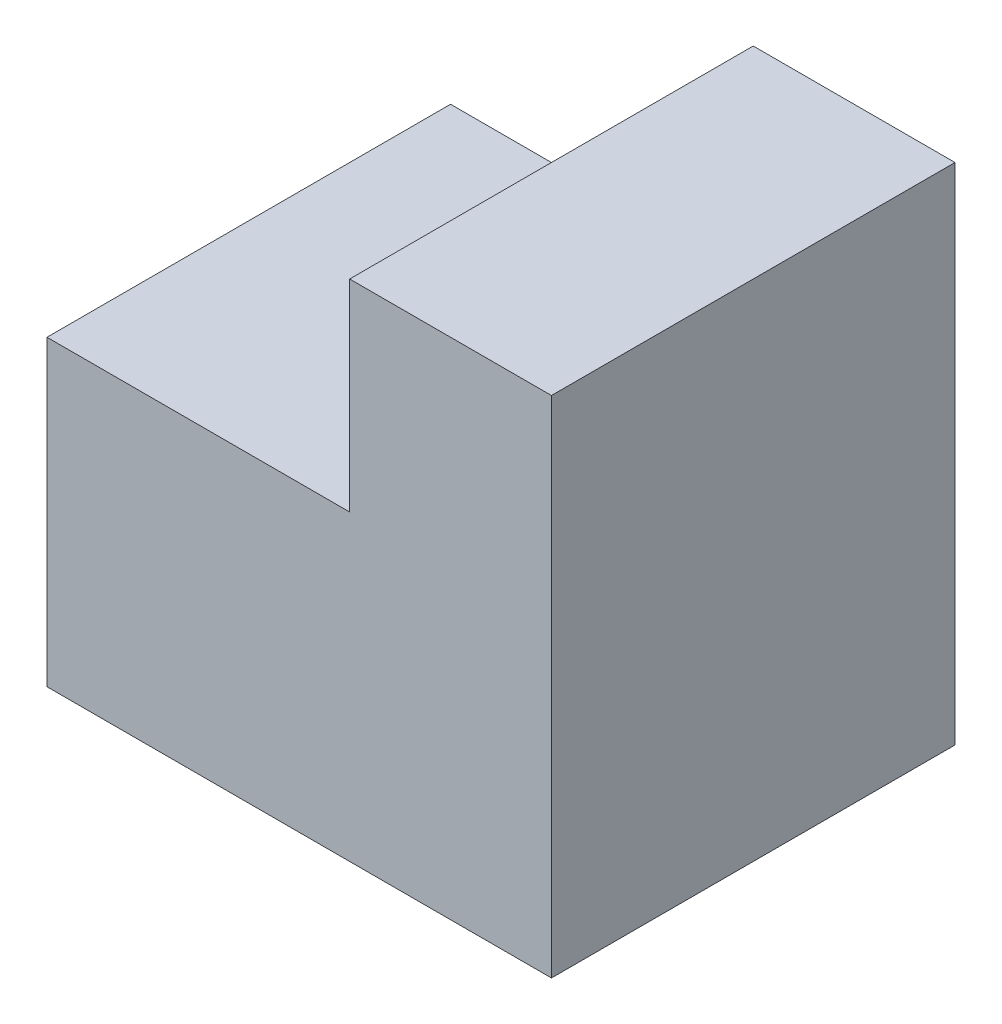
ISO-10303-21;
HEADER;
FILE_DESCRIPTION(('STEP AP214'),'2;1');
FILE_NAME('part.step','',(''),(''),'','','');
FILE_SCHEMA(('AUTOMOTIVE_DESIGN { 1 0 10303 214 1 1 1 1 }'));
ENDSEC;
DATA;
#1=APPLICATION_CONTEXT('core data for automotive mechanical design processes');
#2=APPLICATION_PROTOCOL_DEFINITION('international standard','automotive_design',2000,#1);
#3=PRODUCT_CONTEXT('',#1,'mechanical');
#4=PRODUCT('Part','Part','',(#3));
#5=PRODUCT_RELATED_PRODUCT_CATEGORY('part','',(#4));
#6=PRODUCT_DEFINITION_FORMATION('','',#4);
#7=PRODUCT_DEFINITION_CONTEXT('part definition',#1,'design');
#8=PRODUCT_DEFINITION('design','',#6,#7);
#9=PRODUCT_DEFINITION_SHAPE('','',#8);
#10=(LENGTH_UNIT() NAMED_UNIT(*) SI_UNIT(.MILLI.,.METRE.));
#11=(NAMED_UNIT(*) PLANE_ANGLE_UNIT() SI_UNIT($,.RADIAN.));
#12=(NAMED_UNIT(*) SI_UNIT($,.STERADIAN.) SOLID_ANGLE_UNIT());
#13=UNCERTAINTY_MEASURE_WITH_UNIT(LENGTH_MEASURE(1.E-05),#10,'distance_accuracy_value','');
#14=(GEOMETRIC_REPRESENTATION_CONTEXT(3) GLOBAL_UNCERTAINTY_ASSIGNED_CONTEXT((#13)) GLOBAL_UNIT_ASSIGNED_CONTEXT((#10,
#11,#12)) REPRESENTATION_CONTEXT('',''));
#15=CARTESIAN_POINT('',(0.,0.,0.));
#16=DIRECTION('',(0.,0.,1.));
#17=DIRECTION('',(1.,0.,0.));
#18=AXIS2_PLACEMENT_3D('',#15,#16,#17);
#19=CARTESIAN_POINT('',(30.,50.,-40.));
#20=DIRECTION('',(-1.,0.,0.));
#21=DIRECTION('',(0.,-1.,0.));
#22=AXIS2_PLACEMENT_3D('',#19,#20,#21);
#23=PLANE('',#22);
#24=DIRECTION('',(0.,-1.,0.));
#25=VECTOR('',#24,1.);
#26=CARTESIAN_POINT('',(30.,50.,0.));
#27=LINE('',#26,#25);
#28=CARTESIAN_POINT('',(30.,50.,0.));
#29=VERTEX_POINT('',#28);
#30=CARTESIAN_POINT('',(30.,30.,0.));
#31=VERTEX_POINT('',#30);
#32=EDGE_CURVE('E134',#29,#31,#27,.T.);
#33=ORIENTED_EDGE('',*,*,#32,.F.);
#34=DIRECTION('',(0.,0.,1.));
#35=VECTOR('',#34,1.);
#36=CARTESIAN_POINT('',(30.,50.,-40.));
#37=LINE('',#36,#35);
#38=CARTESIAN_POINT('',(30.,50.,-40.));
#39=VERTEX_POINT('',#38);
#40=EDGE_CURVE('E11',#39,#29,#37,.T.);
#41=ORIENTED_EDGE('',*,*,#40,.F.);
#42=DIRECTION('',(0.,-1.,0.));
#43=VECTOR('',#42,1.);
#44=CARTESIAN_POINT('',(30.,50.,-40.));
#45=LINE('',#44,#43);
#46=CARTESIAN_POINT('',(30.,30.,-40.));
#47=VERTEX_POINT('',#46);
#48=EDGE_CURVE('E154',#39,#47,#45,.T.);
#49=ORIENTED_EDGE('',*,*,#48,.T.);
#50=DIRECTION('',(0.,0.,1.));
#51=VECTOR('',#50,1.);
#52=CARTESIAN_POINT('',(30.,30.,-40.));
#53=LINE('',#52,#51);
#54=EDGE_CURVE('E46',#47,#31,#53,.T.);
#55=ORIENTED_EDGE('',*,*,#54,.T.);
#56=EDGE_LOOP('',(#33,#41,#49,#55));
#57=FACE_BOUND('',#56,.T.);
#58=ADVANCED_FACE('F43',(#57),#23,.T.);
#59=CARTESIAN_POINT('',(50.,50.,-40.));
#60=DIRECTION('',(0.,1.,0.));
#61=DIRECTION('',(0.,0.,1.));
#62=AXIS2_PLACEMENT_3D('',#59,#60,#61);
#63=PLANE('',#62);
#64=DIRECTION('',(-1.,0.,0.));
#65=VECTOR('',#64,1.);
#66=CARTESIAN_POINT('',(50.,50.,0.));
#67=LINE('',#66,#65);
#68=CARTESIAN_POINT('',(50.,50.,0.));
#69=VERTEX_POINT('',#68);
#70=EDGE_CURVE('E151',#69,#29,#67,.T.);
#71=ORIENTED_EDGE('',*,*,#70,.F.);
#72=DIRECTION('',(0.,0.,1.));
#73=VECTOR('',#72,1.);
#74=CARTESIAN_POINT('',(50.,50.,-40.));
#75=LINE('',#74,#73);
#76=CARTESIAN_POINT('',(50.,50.,-40.));
#77=VERTEX_POINT('',#76);
#78=EDGE_CURVE('E53',#77,#69,#75,.T.);
#79=ORIENTED_EDGE('',*,*,#78,.F.);
#80=DIRECTION('',(-1.,0.,0.));
#81=VECTOR('',#80,1.);
#82=CARTESIAN_POINT('',(50.,50.,-40.));
#83=LINE('',#82,#81);
#84=EDGE_CURVE('E120',#77,#39,#83,.T.);
#85=ORIENTED_EDGE('',*,*,#84,.T.);
#86=ORIENTED_EDGE('',*,*,#40,.T.);
#87=EDGE_LOOP('',(#71,#79,#85,#86));
#88=FACE_BOUND('',#87,.T.);
#89=ADVANCED_FACE('F166',(#88),#63,.T.);
#90=CARTESIAN_POINT('',(50.,0.,-40.));
#91=DIRECTION('',(1.,0.,0.));
#92=DIRECTION('',(0.,0.,-1.));
#93=AXIS2_PLACEMENT_3D('',#90,#91,#92);
#94=PLANE('',#93);
#95=DIRECTION('',(0.,1.,0.));
#96=VECTOR('',#95,1.);
#97=CARTESIAN_POINT('',(50.,0.,0.));
#98=LINE('',#97,#96);
#99=CARTESIAN_POINT('',(50.,0.,0.));
#100=VERTEX_POINT('',#99);
#101=EDGE_CURVE('E106',#100,#69,#98,.T.);
#102=ORIENTED_EDGE('',*,*,#101,.F.);
#103=DIRECTION('',(0.,0.,1.));
#104=VECTOR('',#103,1.);
#105=CARTESIAN_POINT('',(50.,0.,-40.));
#106=LINE('',#105,#104);
#107=CARTESIAN_POINT('',(50.,0.,-40.));
#108=VERTEX_POINT('',#107);
#109=EDGE_CURVE('E101',#108,#100,#106,.T.);
#110=ORIENTED_EDGE('',*,*,#109,.F.);
#111=DIRECTION('',(0.,1.,0.));
#112=VECTOR('',#111,1.);
#113=CARTESIAN_POINT('',(50.,0.,-40.));
#114=LINE('',#113,#112);
#115=EDGE_CURVE('E104',#108,#77,#114,.T.);
#116=ORIENTED_EDGE('',*,*,#115,.T.);
#117=ORIENTED_EDGE('',*,*,#78,.T.);
#118=EDGE_LOOP('',(#102,#110,#116,#117));
#119=FACE_BOUND('',#118,.T.);
#120=ADVANCED_FACE('F103',(#119),#94,.T.);
#121=CARTESIAN_POINT('',(0.,0.,-40.));
#122=DIRECTION('',(0.,-1.,0.));
#123=DIRECTION('',(0.,0.,-1.));
#124=AXIS2_PLACEMENT_3D('',#121,#122,#123);
#125=PLANE('',#124);
#126=DIRECTION('',(1.,0.,0.));
#127=VECTOR('',#126,1.);
#128=CARTESIAN_POINT('',(0.,0.,0.));
#129=LINE('',#128,#127);
#130=CARTESIAN_POINT('',(0.,0.,0.));
#131=VERTEX_POINT('',#130);
#132=EDGE_CURVE('E146',#131,#100,#129,.T.);
#133=ORIENTED_EDGE('',*,*,#132,.F.);
#134=DIRECTION('',(0.,0.,1.));
#135=VECTOR('',#134,1.);
#136=CARTESIAN_POINT('',(0.,0.,-40.));
#137=LINE('',#136,#135);
#138=CARTESIAN_POINT('',(0.,0.,-40.));
#139=VERTEX_POINT('',#138);
#140=EDGE_CURVE('E112',#139,#131,#137,.T.);
#141=ORIENTED_EDGE('',*,*,#140,.F.);
#142=DIRECTION('',(1.,0.,0.));
#143=VECTOR('',#142,1.);
#144=CARTESIAN_POINT('',(0.,0.,-40.));
#145=LINE('',#144,#143);
#146=EDGE_CURVE('E118',#139,#108,#145,.T.);
#147=ORIENTED_EDGE('',*,*,#146,.T.);
#148=ORIENTED_EDGE('',*,*,#109,.T.);
#149=EDGE_LOOP('',(#133,#141,#147,#148));
#150=FACE_BOUND('',#149,.T.);
#151=ADVANCED_FACE('F123',(#150),#125,.T.);
#152=CARTESIAN_POINT('',(0.,30.,-40.));
#153=DIRECTION('',(-1.,0.,0.));
#154=DIRECTION('',(0.,-1.,0.));
#155=AXIS2_PLACEMENT_3D('',#152,#153,#154);
#156=PLANE('',#155);
#157=DIRECTION('',(0.,-1.,0.));
#158=VECTOR('',#157,1.);
#159=CARTESIAN_POINT('',(0.,30.,0.));
#160=LINE('',#159,#158);
#161=CARTESIAN_POINT('',(0.,30.,0.));
#162=VERTEX_POINT('',#161);
#163=EDGE_CURVE('E142',#162,#131,#160,.T.);
#164=ORIENTED_EDGE('',*,*,#163,.F.);
#165=DIRECTION('',(0.,0.,1.));
#166=VECTOR('',#165,1.);
#167=CARTESIAN_POINT('',(0.,30.,-40.));
#168=LINE('',#167,#166);
#169=CARTESIAN_POINT('',(0.,30.,-40.));
#170=VERTEX_POINT('',#169);
#171=EDGE_CURVE('E159',#170,#162,#168,.T.);
#172=ORIENTED_EDGE('',*,*,#171,.F.);
#173=DIRECTION('',(0.,-1.,0.));
#174=VECTOR('',#173,1.);
#175=CARTESIAN_POINT('',(0.,30.,-40.));
#176=LINE('',#175,#174);
#177=EDGE_CURVE('E125',#170,#139,#176,.T.);
#178=ORIENTED_EDGE('',*,*,#177,.T.);
#179=ORIENTED_EDGE('',*,*,#140,.T.);
#180=EDGE_LOOP('',(#164,#172,#178,#179));
#181=FACE_BOUND('',#180,.T.);
#182=ADVANCED_FACE('F179',(#181),#156,.T.);
#183=CARTESIAN_POINT('',(30.,30.,-40.));
#184=DIRECTION('',(0.,1.,0.));
#185=DIRECTION('',(-1.,0.,0.));
#186=AXIS2_PLACEMENT_3D('',#183,#184,#185);
#187=PLANE('',#186);
#188=DIRECTION('',(-1.,0.,0.));
#189=VECTOR('',#188,1.);
#190=CARTESIAN_POINT('',(30.,30.,0.));
#191=LINE('',#190,#189);
#192=EDGE_CURVE('E138',#31,#162,#191,.T.);
#193=ORIENTED_EDGE('',*,*,#192,.F.);
#194=ORIENTED_EDGE('',*,*,#54,.F.);
#195=DIRECTION('',(-1.,0.,0.));
#196=VECTOR('',#195,1.);
#197=CARTESIAN_POINT('',(30.,30.,-40.));
#198=LINE('',#197,#196);
#199=EDGE_CURVE('E128',#47,#170,#198,.T.);
#200=ORIENTED_EDGE('',*,*,#199,.T.);
#201=ORIENTED_EDGE('',*,*,#171,.T.);
#202=EDGE_LOOP('',(#193,#194,#200,#201));
#203=FACE_BOUND('',#202,.T.);
#204=ADVANCED_FACE('F163',(#203),#187,.T.);
#205=CARTESIAN_POINT('',(0.,0.,-40.));
#206=DIRECTION('',(0.,0.,-1.));
#207=DIRECTION('',(-1.,0.,0.));
#208=AXIS2_PLACEMENT_3D('',#205,#206,#207);
#209=PLANE('',#208);
#210=ORIENTED_EDGE('',*,*,#48,.F.);
#211=ORIENTED_EDGE('',*,*,#84,.F.);
#212=ORIENTED_EDGE('',*,*,#115,.F.);
#213=ORIENTED_EDGE('',*,*,#146,.F.);
#214=ORIENTED_EDGE('',*,*,#177,.F.);
#215=ORIENTED_EDGE('',*,*,#199,.F.);
#216=EDGE_LOOP('',(#210,#211,#212,#213,#214,#215));
#217=FACE_BOUND('',#216,.T.);
#218=ADVANCED_FACE('F116',(#217),#209,.T.);
#219=CARTESIAN_POINT('',(0.,0.,0.));
#220=DIRECTION('',(0.,0.,-1.));
#221=DIRECTION('',(-1.,0.,0.));
#222=AXIS2_PLACEMENT_3D('',#219,#220,#221);
#223=PLANE('',#222);
#224=ORIENTED_EDGE('',*,*,#32,.T.);
#225=ORIENTED_EDGE('',*,*,#192,.T.);
#226=ORIENTED_EDGE('',*,*,#163,.T.);
#227=ORIENTED_EDGE('',*,*,#132,.T.);
#228=ORIENTED_EDGE('',*,*,#101,.T.);
#229=ORIENTED_EDGE('',*,*,#70,.T.);
#230=EDGE_LOOP('',(#224,#225,#226,#227,#228,#229));
#231=FACE_BOUND('',#230,.T.);
#232=ADVANCED_FACE('F165',(#231),#223,.F.);
#233=CLOSED_SHELL('',(#58,#89,#120,#151,#182,#204,#218,#232));
#234=MANIFOLD_SOLID_BREP('B2',#233);
#235=ADVANCED_BREP_SHAPE_REPRESENTATION('',(#18,#234),#14);
#236=SHAPE_DEFINITION_REPRESENTATION(#9,#235);
ENDSEC;
END-ISO-10303-21;
